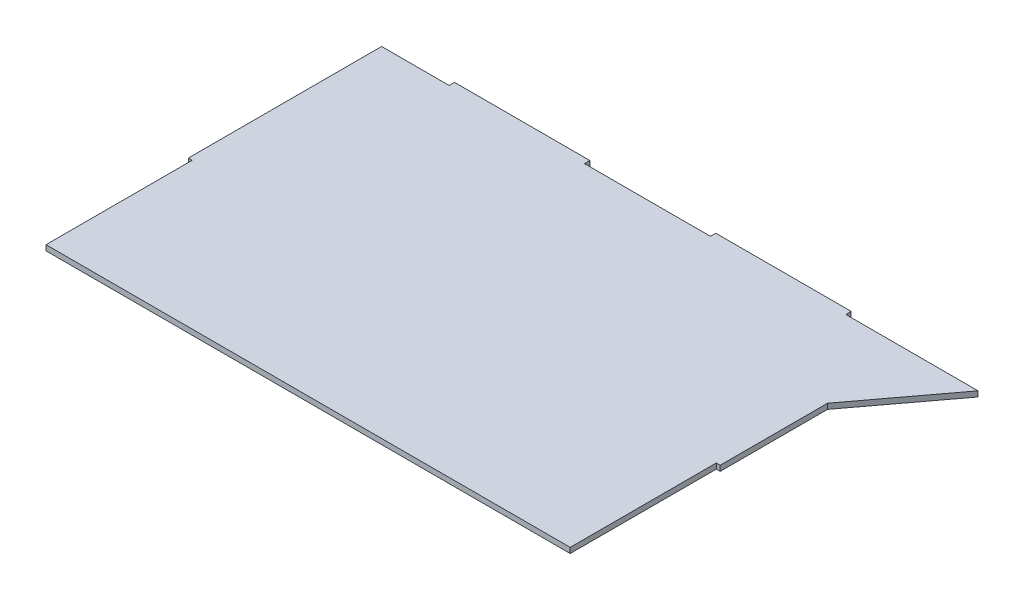
ISO-10303-21;
HEADER;
FILE_DESCRIPTION(('STEP AP214'),'2;1');
FILE_NAME('part.step','',(''),(''),'','','');
FILE_SCHEMA(('AUTOMOTIVE_DESIGN { 1 0 10303 214 1 1 1 1 }'));
ENDSEC;
DATA;
#1=APPLICATION_CONTEXT('core data for automotive mechanical design processes');
#2=APPLICATION_PROTOCOL_DEFINITION('international standard','automotive_design',2000,#1);
#3=PRODUCT_CONTEXT('',#1,'mechanical');
#4=PRODUCT('Part','Part','',(#3));
#5=PRODUCT_RELATED_PRODUCT_CATEGORY('part','',(#4));
#6=PRODUCT_DEFINITION_FORMATION('','',#4);
#7=PRODUCT_DEFINITION_CONTEXT('part definition',#1,'design');
#8=PRODUCT_DEFINITION('design','',#6,#7);
#9=PRODUCT_DEFINITION_SHAPE('','',#8);
#10=(LENGTH_UNIT() NAMED_UNIT(*) SI_UNIT(.MILLI.,.METRE.));
#11=(NAMED_UNIT(*) PLANE_ANGLE_UNIT() SI_UNIT($,.RADIAN.));
#12=(NAMED_UNIT(*) SI_UNIT($,.STERADIAN.) SOLID_ANGLE_UNIT());
#13=UNCERTAINTY_MEASURE_WITH_UNIT(LENGTH_MEASURE(1.E-05),#10,'distance_accuracy_value','');
#14=(GEOMETRIC_REPRESENTATION_CONTEXT(3) GLOBAL_UNCERTAINTY_ASSIGNED_CONTEXT((#13)) GLOBAL_UNIT_ASSIGNED_CONTEXT((#10,
#11,#12)) REPRESENTATION_CONTEXT('',''));
#15=CARTESIAN_POINT('',(0.,0.,0.));
#16=DIRECTION('',(0.,0.,1.));
#17=DIRECTION('',(1.,0.,0.));
#18=AXIS2_PLACEMENT_3D('',#15,#16,#17);
#19=CARTESIAN_POINT('',(157.16480632,-1.5875,200.60000012));
#20=DIRECTION('',(-1.,0.,0.));
#21=DIRECTION('',(0.,0.,1.));
#22=AXIS2_PLACEMENT_3D('',#19,#20,#21);
#23=PLANE('',#22);
#24=DIRECTION('',(0.,-1.,0.));
#25=VECTOR('',#24,1.);
#26=CARTESIAN_POINT('',(157.16480632,1.5875,50.8));
#27=LINE('',#26,#25);
#28=CARTESIAN_POINT('',(157.16480632,1.5875,50.8));
#29=VERTEX_POINT('',#28);
#30=CARTESIAN_POINT('',(157.16480632,-1.5875,50.8));
#31=VERTEX_POINT('',#30);
#32=EDGE_CURVE('E59',#29,#31,#27,.T.);
#33=ORIENTED_EDGE('',*,*,#32,.F.);
#34=DIRECTION('',(0.,0.,-1.));
#35=VECTOR('',#34,1.);
#36=CARTESIAN_POINT('',(157.16480632,1.5875,200.60000012));
#37=LINE('',#36,#35);
#38=CARTESIAN_POINT('',(157.16480632,1.5875,114.24000012));
#39=VERTEX_POINT('',#38);
#40=EDGE_CURVE('E185',#39,#29,#37,.T.);
#41=ORIENTED_EDGE('',*,*,#40,.F.);
#42=DIRECTION('',(0.,1.,0.));
#43=VECTOR('',#42,1.);
#44=CARTESIAN_POINT('',(157.16480632,-1.5875,114.24000012));
#45=LINE('',#44,#43);
#46=CARTESIAN_POINT('',(157.16480632,-1.5875,114.24000012));
#47=VERTEX_POINT('',#46);
#48=EDGE_CURVE('E11',#47,#39,#45,.T.);
#49=ORIENTED_EDGE('',*,*,#48,.F.);
#50=DIRECTION('',(0.,0.,-1.));
#51=VECTOR('',#50,1.);
#52=CARTESIAN_POINT('',(157.16480632,-1.5875,200.60000012));
#53=LINE('',#52,#51);
#54=EDGE_CURVE('E278',#47,#31,#53,.T.);
#55=ORIENTED_EDGE('',*,*,#54,.T.);
#56=EDGE_LOOP('',(#33,#41,#49,#55));
#57=FACE_BOUND('',#56,.T.);
#58=ADVANCED_FACE('F45',(#57),#23,.F.);
#59=CARTESIAN_POINT('',(0.,0.,0.));
#60=DIRECTION('',(0.,0.,-1.));
#61=DIRECTION('',(-1.,0.,0.));
#62=AXIS2_PLACEMENT_3D('',#59,#60,#61);
#63=PLANE('',#62);
#64=DIRECTION('',(-1.,0.,0.));
#65=VECTOR('',#64,1.);
#66=CARTESIAN_POINT('',(-157.16480632,1.5875,0.));
#67=LINE('',#66,#65);
#68=CARTESIAN_POINT('',(-117.26519368,1.5875,0.));
#69=VERTEX_POINT('',#68);
#70=CARTESIAN_POINT('',(-157.16480632,1.5875,0.));
#71=VERTEX_POINT('',#70);
#72=EDGE_CURVE('E67',#69,#71,#67,.T.);
#73=ORIENTED_EDGE('',*,*,#72,.F.);
#74=DIRECTION('',(0.,1.,0.));
#75=VECTOR('',#74,1.);
#76=CARTESIAN_POINT('',(-117.26519368,0.,0.));
#77=LINE('',#76,#75);
#78=CARTESIAN_POINT('',(-117.26519368,-1.5875,0.));
#79=VERTEX_POINT('',#78);
#80=EDGE_CURVE('E189',#79,#69,#77,.T.);
#81=ORIENTED_EDGE('',*,*,#80,.F.);
#82=DIRECTION('',(1.,0.,0.));
#83=VECTOR('',#82,1.);
#84=CARTESIAN_POINT('',(-157.16480632,-1.5875,0.));
#85=LINE('',#84,#83);
#86=CARTESIAN_POINT('',(-157.16480632,-1.5875,0.));
#87=VERTEX_POINT('',#86);
#88=EDGE_CURVE('E276',#87,#79,#85,.T.);
#89=ORIENTED_EDGE('',*,*,#88,.F.);
#90=DIRECTION('',(0.,-1.,0.));
#91=VECTOR('',#90,1.);
#92=CARTESIAN_POINT('',(-157.16480632,-1.5875,0.));
#93=LINE('',#92,#91);
#94=EDGE_CURVE('E173',#71,#87,#93,.T.);
#95=ORIENTED_EDGE('',*,*,#94,.F.);
#96=EDGE_LOOP('',(#73,#81,#89,#95));
#97=FACE_BOUND('',#96,.T.);
#98=ADVANCED_FACE('F348',(#97),#63,.T.);
#99=CARTESIAN_POINT('',(117.16480632,-1.5875,0.));
#100=VERTEX_POINT('',#99);
#101=CARTESIAN_POINT('',(195.26480632,-1.5875,0.));
#102=VERTEX_POINT('',#101);
#103=EDGE_CURVE('E282',#100,#102,#85,.T.);
#104=ORIENTED_EDGE('',*,*,#103,.F.);
#105=DIRECTION('',(0.,1.,0.));
#106=VECTOR('',#105,1.);
#107=CARTESIAN_POINT('',(117.16480632,0.,0.));
#108=LINE('',#107,#106);
#109=CARTESIAN_POINT('',(117.16480632,1.5875,0.));
#110=VERTEX_POINT('',#109);
#111=EDGE_CURVE('E169',#100,#110,#108,.T.);
#112=ORIENTED_EDGE('',*,*,#111,.T.);
#113=CARTESIAN_POINT('',(195.26480632,1.5875,0.));
#114=VERTEX_POINT('',#113);
#115=EDGE_CURVE('E163',#114,#110,#67,.T.);
#116=ORIENTED_EDGE('',*,*,#115,.F.);
#117=DIRECTION('',(0.,-1.,0.));
#118=VECTOR('',#117,1.);
#119=CARTESIAN_POINT('',(195.26480632,1.5875,0.));
#120=LINE('',#119,#118);
#121=EDGE_CURVE('E166',#114,#102,#120,.T.);
#122=ORIENTED_EDGE('',*,*,#121,.T.);
#123=EDGE_LOOP('',(#104,#112,#116,#122));
#124=FACE_BOUND('',#123,.T.);
#125=ADVANCED_FACE('F165',(#124),#63,.T.);
#126=CARTESIAN_POINT('',(-157.16480632,1.5875,200.60000012));
#127=DIRECTION('',(0.,-1.,0.));
#128=DIRECTION('',(0.,0.,-1.));
#129=AXIS2_PLACEMENT_3D('',#126,#127,#128);
#130=PLANE('',#129);
#131=DIRECTION('',(-1.,0.,0.));
#132=VECTOR('',#131,1.);
#133=CARTESIAN_POINT('',(-157.16480632,1.5875,114.24000012));
#134=LINE('',#133,#132);
#135=CARTESIAN_POINT('',(154.87880632,1.5875,114.24000012));
#136=VERTEX_POINT('',#135);
#137=EDGE_CURVE('E253',#39,#136,#134,.T.);
#138=ORIENTED_EDGE('',*,*,#137,.F.);
#139=ORIENTED_EDGE('',*,*,#40,.T.);
#140=DIRECTION('',(-0.6,0.,0.8));
#141=VECTOR('',#140,1.);
#142=CARTESIAN_POINT('',(195.26480632,1.5875,0.));
#143=LINE('',#142,#141);
#144=EDGE_CURVE('E179',#114,#29,#143,.T.);
#145=ORIENTED_EDGE('',*,*,#144,.F.);
#146=ORIENTED_EDGE('',*,*,#115,.T.);
#147=DIRECTION('',(0.,0.,1.));
#148=VECTOR('',#147,1.);
#149=CARTESIAN_POINT('',(117.16480632,1.5875,-3.175));
#150=LINE('',#149,#148);
#151=CARTESIAN_POINT('',(117.16480632,1.5875,-3.175));
#152=VERTEX_POINT('',#151);
#153=EDGE_CURVE('E235',#152,#110,#150,.T.);
#154=ORIENTED_EDGE('',*,*,#153,.F.);
#155=DIRECTION('',(-1.,0.,0.));
#156=VECTOR('',#155,1.);
#157=CARTESIAN_POINT('',(0.,1.5875,-3.175));
#158=LINE('',#157,#156);
#159=CARTESIAN_POINT('',(37.16480632,1.5875,-3.175));
#160=VERTEX_POINT('',#159);
#161=EDGE_CURVE('E223',#152,#160,#158,.T.);
#162=ORIENTED_EDGE('',*,*,#161,.T.);
#163=DIRECTION('',(0.,0.,1.));
#164=VECTOR('',#163,1.);
#165=CARTESIAN_POINT('',(37.16480632,1.5875,-3.175));
#166=LINE('',#165,#164);
#167=CARTESIAN_POINT('',(37.16480632,1.5875,0.));
#168=VERTEX_POINT('',#167);
#169=EDGE_CURVE('E237',#160,#168,#166,.T.);
#170=ORIENTED_EDGE('',*,*,#169,.T.);
#171=CARTESIAN_POINT('',(-37.2651936800001,1.5875,0.));
#172=VERTEX_POINT('',#171);
#173=EDGE_CURVE('E174',#168,#172,#67,.T.);
#174=ORIENTED_EDGE('',*,*,#173,.T.);
#175=DIRECTION('',(0.,0.,1.));
#176=VECTOR('',#175,1.);
#177=CARTESIAN_POINT('',(-37.2651936800001,1.5875,-3.175));
#178=LINE('',#177,#176);
#179=CARTESIAN_POINT('',(-37.2651936800001,1.5875,-3.175));
#180=VERTEX_POINT('',#179);
#181=EDGE_CURVE('E209',#180,#172,#178,.T.);
#182=ORIENTED_EDGE('',*,*,#181,.F.);
#183=DIRECTION('',(-1.,0.,0.));
#184=VECTOR('',#183,1.);
#185=CARTESIAN_POINT('',(-154.43,1.5875,-3.175));
#186=LINE('',#185,#184);
#187=CARTESIAN_POINT('',(-117.26519368,1.5875,-3.175));
#188=VERTEX_POINT('',#187);
#189=EDGE_CURVE('E197',#180,#188,#186,.T.);
#190=ORIENTED_EDGE('',*,*,#189,.T.);
#191=DIRECTION('',(0.,0.,1.));
#192=VECTOR('',#191,1.);
#193=CARTESIAN_POINT('',(-117.26519368,1.5875,-3.175));
#194=LINE('',#193,#192);
#195=EDGE_CURVE('E212',#188,#69,#194,.T.);
#196=ORIENTED_EDGE('',*,*,#195,.T.);
#197=ORIENTED_EDGE('',*,*,#72,.T.);
#198=DIRECTION('',(0.,0.,-1.));
#199=VECTOR('',#198,1.);
#200=CARTESIAN_POINT('',(-157.16480632,1.5875,200.60000012));
#201=LINE('',#200,#199);
#202=CARTESIAN_POINT('',(-157.16480632,1.5875,114.24000012));
#203=VERTEX_POINT('',#202);
#204=EDGE_CURVE('E289',#203,#71,#201,.T.);
#205=ORIENTED_EDGE('',*,*,#204,.F.);
#206=DIRECTION('',(1.,0.,0.));
#207=VECTOR('',#206,1.);
#208=CARTESIAN_POINT('',(-157.16480632,1.5875,114.24000012));
#209=LINE('',#208,#207);
#210=CARTESIAN_POINT('',(-154.87880632,1.5875,114.24000012));
#211=VERTEX_POINT('',#210);
#212=EDGE_CURVE('E270',#203,#211,#209,.T.);
#213=ORIENTED_EDGE('',*,*,#212,.T.);
#214=DIRECTION('',(0.,0.,-1.));
#215=VECTOR('',#214,1.);
#216=CARTESIAN_POINT('',(-154.87880632,1.5875,200.60000012));
#217=LINE('',#216,#215);
#218=CARTESIAN_POINT('',(-154.87880632,1.5875,200.60000012));
#219=VERTEX_POINT('',#218);
#220=EDGE_CURVE('E268',#219,#211,#217,.T.);
#221=ORIENTED_EDGE('',*,*,#220,.F.);
#222=DIRECTION('',(-1.,0.,0.));
#223=VECTOR('',#222,1.);
#224=CARTESIAN_POINT('',(-157.16480632,1.5875,200.60000012));
#225=LINE('',#224,#223);
#226=CARTESIAN_POINT('',(154.87880632,1.5875,200.60000012));
#227=VERTEX_POINT('',#226);
#228=EDGE_CURVE('E273',#227,#219,#225,.T.);
#229=ORIENTED_EDGE('',*,*,#228,.F.);
#230=DIRECTION('',(0.,0.,-1.));
#231=VECTOR('',#230,1.);
#232=CARTESIAN_POINT('',(154.87880632,1.5875,200.60000012));
#233=LINE('',#232,#231);
#234=EDGE_CURVE('E255',#227,#136,#233,.T.);
#235=ORIENTED_EDGE('',*,*,#234,.T.);
#236=EDGE_LOOP('',(#138,#139,#145,#146,#154,#162,#170,#174,#182,#190,#196,#197,#205,#213,#221,
#229,#235));
#237=FACE_BOUND('',#236,.T.);
#238=ADVANCED_FACE('F184',(#237),#130,.F.);
#239=CARTESIAN_POINT('',(-157.16480632,-1.5875,200.60000012));
#240=DIRECTION('',(0.,1.,0.));
#241=DIRECTION('',(0.,0.,1.));
#242=AXIS2_PLACEMENT_3D('',#239,#240,#241);
#243=PLANE('',#242);
#244=DIRECTION('',(-1.,0.,0.));
#245=VECTOR('',#244,1.);
#246=CARTESIAN_POINT('',(0.,-1.5875,114.24000012));
#247=LINE('',#246,#245);
#248=CARTESIAN_POINT('',(154.87880632,-1.5875,114.24000012));
#249=VERTEX_POINT('',#248);
#250=EDGE_CURVE('E243',#47,#249,#247,.T.);
#251=ORIENTED_EDGE('',*,*,#250,.T.);
#252=DIRECTION('',(0.,0.,-1.));
#253=VECTOR('',#252,1.);
#254=CARTESIAN_POINT('',(154.87880632,-1.5875,0.));
#255=LINE('',#254,#253);
#256=CARTESIAN_POINT('',(154.87880632,-1.5875,200.60000012));
#257=VERTEX_POINT('',#256);
#258=EDGE_CURVE('E246',#257,#249,#255,.T.);
#259=ORIENTED_EDGE('',*,*,#258,.F.);
#260=DIRECTION('',(1.,0.,0.));
#261=VECTOR('',#260,1.);
#262=CARTESIAN_POINT('',(-157.16480632,-1.5875,200.60000012));
#263=LINE('',#262,#261);
#264=CARTESIAN_POINT('',(-154.87880632,-1.5875,200.60000012));
#265=VERTEX_POINT('',#264);
#266=EDGE_CURVE('E275',#265,#257,#263,.T.);
#267=ORIENTED_EDGE('',*,*,#266,.F.);
#268=DIRECTION('',(0.,0.,-1.));
#269=VECTOR('',#268,1.);
#270=CARTESIAN_POINT('',(-154.87880632,-1.5875,0.));
#271=LINE('',#270,#269);
#272=CARTESIAN_POINT('',(-154.87880632,-1.5875,114.24000012));
#273=VERTEX_POINT('',#272);
#274=EDGE_CURVE('E258',#265,#273,#271,.T.);
#275=ORIENTED_EDGE('',*,*,#274,.T.);
#276=DIRECTION('',(1.,0.,0.));
#277=VECTOR('',#276,1.);
#278=CARTESIAN_POINT('',(0.,-1.5875,114.24000012));
#279=LINE('',#278,#277);
#280=CARTESIAN_POINT('',(-157.16480632,-1.5875,114.24000012));
#281=VERTEX_POINT('',#280);
#282=EDGE_CURVE('E261',#281,#273,#279,.T.);
#283=ORIENTED_EDGE('',*,*,#282,.F.);
#284=DIRECTION('',(0.,0.,-1.));
#285=VECTOR('',#284,1.);
#286=CARTESIAN_POINT('',(-157.16480632,-1.5875,200.60000012));
#287=LINE('',#286,#285);
#288=EDGE_CURVE('E287',#281,#87,#287,.T.);
#289=ORIENTED_EDGE('',*,*,#288,.T.);
#290=ORIENTED_EDGE('',*,*,#88,.T.);
#291=DIRECTION('',(0.,0.,1.));
#292=VECTOR('',#291,1.);
#293=CARTESIAN_POINT('',(-117.26519368,-1.5875,-3.175));
#294=LINE('',#293,#292);
#295=CARTESIAN_POINT('',(-117.26519368,-1.5875,-3.175));
#296=VERTEX_POINT('',#295);
#297=EDGE_CURVE('E214',#296,#79,#294,.T.);
#298=ORIENTED_EDGE('',*,*,#297,.F.);
#299=DIRECTION('',(-1.,0.,0.));
#300=VECTOR('',#299,1.);
#301=CARTESIAN_POINT('',(-154.43,-1.5875,-3.175));
#302=LINE('',#301,#300);
#303=CARTESIAN_POINT('',(-37.2651936800001,-1.5875,-3.175));
#304=VERTEX_POINT('',#303);
#305=EDGE_CURVE('E191',#304,#296,#302,.T.);
#306=ORIENTED_EDGE('',*,*,#305,.F.);
#307=DIRECTION('',(0.,0.,1.));
#308=VECTOR('',#307,1.);
#309=CARTESIAN_POINT('',(-37.2651936800001,-1.5875,-3.175));
#310=LINE('',#309,#308);
#311=CARTESIAN_POINT('',(-37.2651936800001,-1.5875,0.));
#312=VERTEX_POINT('',#311);
#313=EDGE_CURVE('E203',#304,#312,#310,.T.);
#314=ORIENTED_EDGE('',*,*,#313,.T.);
#315=CARTESIAN_POINT('',(37.1648063199999,-1.5875,0.));
#316=VERTEX_POINT('',#315);
#317=EDGE_CURVE('E285',#312,#316,#85,.T.);
#318=ORIENTED_EDGE('',*,*,#317,.T.);
#319=DIRECTION('',(0.,0.,1.));
#320=VECTOR('',#319,1.);
#321=CARTESIAN_POINT('',(37.16480632,-1.5875,-3.175));
#322=LINE('',#321,#320);
#323=CARTESIAN_POINT('',(37.16480632,-1.5875,-3.175));
#324=VERTEX_POINT('',#323);
#325=EDGE_CURVE('E240',#324,#316,#322,.T.);
#326=ORIENTED_EDGE('',*,*,#325,.F.);
#327=DIRECTION('',(-1.,0.,0.));
#328=VECTOR('',#327,1.);
#329=CARTESIAN_POINT('',(0.,-1.5875,-3.175));
#330=LINE('',#329,#328);
#331=CARTESIAN_POINT('',(117.16480632,-1.5875,-3.175));
#332=VERTEX_POINT('',#331);
#333=EDGE_CURVE('E218',#332,#324,#330,.T.);
#334=ORIENTED_EDGE('',*,*,#333,.F.);
#335=DIRECTION('',(0.,0.,1.));
#336=VECTOR('',#335,1.);
#337=CARTESIAN_POINT('',(117.16480632,-1.5875,-3.175));
#338=LINE('',#337,#336);
#339=EDGE_CURVE('E229',#332,#100,#338,.T.);
#340=ORIENTED_EDGE('',*,*,#339,.T.);
#341=ORIENTED_EDGE('',*,*,#103,.T.);
#342=DIRECTION('',(-0.6,0.,0.8));
#343=VECTOR('',#342,1.);
#344=CARTESIAN_POINT('',(195.26480632,-1.5875,0.));
#345=LINE('',#344,#343);
#346=EDGE_CURVE('E181',#102,#31,#345,.T.);
#347=ORIENTED_EDGE('',*,*,#346,.T.);
#348=ORIENTED_EDGE('',*,*,#54,.F.);
#349=EDGE_LOOP('',(#251,#259,#267,#275,#283,#289,#290,#298,#306,#314,#318,#326,#334,#340,#341,
#347,#348));
#350=FACE_BOUND('',#349,.T.);
#351=ADVANCED_FACE('F311',(#350),#243,.F.);
#352=CARTESIAN_POINT('',(0.,0.,200.60000012));
#353=DIRECTION('',(0.,0.,-1.));
#354=DIRECTION('',(-1.,0.,0.));
#355=AXIS2_PLACEMENT_3D('',#352,#353,#354);
#356=PLANE('',#355);
#357=ORIENTED_EDGE('',*,*,#266,.T.);
#358=DIRECTION('',(0.,-1.,0.));
#359=VECTOR('',#358,1.);
#360=CARTESIAN_POINT('',(154.87880632,1.587512,200.60000012));
#361=LINE('',#360,#359);
#362=EDGE_CURVE('E249',#227,#257,#361,.T.);
#363=ORIENTED_EDGE('',*,*,#362,.F.);
#364=ORIENTED_EDGE('',*,*,#228,.T.);
#365=DIRECTION('',(0.,1.,0.));
#366=VECTOR('',#365,1.);
#367=CARTESIAN_POINT('',(-154.87880632,0.,200.60000012));
#368=LINE('',#367,#366);
#369=EDGE_CURVE('E52',#265,#219,#368,.T.);
#370=ORIENTED_EDGE('',*,*,#369,.F.);
#371=EDGE_LOOP('',(#357,#363,#364,#370));
#372=FACE_BOUND('',#371,.T.);
#373=ADVANCED_FACE('F315',(#372),#356,.F.);
#374=CARTESIAN_POINT('',(-157.16480632,-1.5875,200.60000012));
#375=DIRECTION('',(1.,0.,0.));
#376=DIRECTION('',(0.,0.,-1.));
#377=AXIS2_PLACEMENT_3D('',#374,#375,#376);
#378=PLANE('',#377);
#379=ORIENTED_EDGE('',*,*,#288,.F.);
#380=DIRECTION('',(0.,-1.,0.));
#381=VECTOR('',#380,1.);
#382=CARTESIAN_POINT('',(-157.16480632,1.587512,114.24000012));
#383=LINE('',#382,#381);
#384=EDGE_CURVE('E264',#203,#281,#383,.T.);
#385=ORIENTED_EDGE('',*,*,#384,.F.);
#386=ORIENTED_EDGE('',*,*,#204,.T.);
#387=ORIENTED_EDGE('',*,*,#94,.T.);
#388=EDGE_LOOP('',(#379,#385,#386,#387));
#389=FACE_BOUND('',#388,.T.);
#390=ADVANCED_FACE('F308',(#389),#378,.F.);
#391=DIRECTION('',(0.,1.,0.));
#392=VECTOR('',#391,1.);
#393=CARTESIAN_POINT('',(-37.2651936800001,0.,0.));
#394=LINE('',#393,#392);
#395=EDGE_CURVE('E195',#312,#172,#394,.T.);
#396=ORIENTED_EDGE('',*,*,#395,.T.);
#397=ORIENTED_EDGE('',*,*,#173,.F.);
#398=DIRECTION('',(0.,1.,0.));
#399=VECTOR('',#398,1.);
#400=CARTESIAN_POINT('',(37.16480632,0.,0.));
#401=LINE('',#400,#399);
#402=EDGE_CURVE('E217',#316,#168,#401,.T.);
#403=ORIENTED_EDGE('',*,*,#402,.F.);
#404=ORIENTED_EDGE('',*,*,#317,.F.);
#405=EDGE_LOOP('',(#396,#397,#403,#404));
#406=FACE_BOUND('',#405,.T.);
#407=ADVANCED_FACE('F328',(#406),#63,.T.);
#408=CARTESIAN_POINT('',(0.,1.587512,114.24000012));
#409=DIRECTION('',(0.,0.,-1.));
#410=DIRECTION('',(-1.,0.,0.));
#411=AXIS2_PLACEMENT_3D('',#408,#409,#410);
#412=PLANE('',#411);
#413=ORIENTED_EDGE('',*,*,#384,.T.);
#414=ORIENTED_EDGE('',*,*,#282,.T.);
#415=DIRECTION('',(0.,-1.,0.));
#416=VECTOR('',#415,1.);
#417=CARTESIAN_POINT('',(-154.87880632,1.587512,114.24000012));
#418=LINE('',#417,#416);
#419=EDGE_CURVE('E266',#211,#273,#418,.T.);
#420=ORIENTED_EDGE('',*,*,#419,.F.);
#421=ORIENTED_EDGE('',*,*,#212,.F.);
#422=EDGE_LOOP('',(#413,#414,#420,#421));
#423=FACE_BOUND('',#422,.T.);
#424=ADVANCED_FACE('F304',(#423),#412,.F.);
#425=CARTESIAN_POINT('',(-154.87880632,1.587512,0.));
#426=DIRECTION('',(-1.,0.,0.));
#427=DIRECTION('',(0.,0.,1.));
#428=AXIS2_PLACEMENT_3D('',#425,#426,#427);
#429=PLANE('',#428);
#430=ORIENTED_EDGE('',*,*,#220,.T.);
#431=ORIENTED_EDGE('',*,*,#419,.T.);
#432=ORIENTED_EDGE('',*,*,#274,.F.);
#433=ORIENTED_EDGE('',*,*,#369,.T.);
#434=EDGE_LOOP('',(#430,#431,#432,#433));
#435=FACE_BOUND('',#434,.T.);
#436=ADVANCED_FACE('F296',(#435),#429,.T.);
#437=CARTESIAN_POINT('',(154.87880632,1.587512,0.));
#438=DIRECTION('',(-1.,0.,0.));
#439=DIRECTION('',(0.,0.,1.));
#440=AXIS2_PLACEMENT_3D('',#437,#438,#439);
#441=PLANE('',#440);
#442=ORIENTED_EDGE('',*,*,#362,.T.);
#443=ORIENTED_EDGE('',*,*,#258,.T.);
#444=DIRECTION('',(0.,-1.,0.));
#445=VECTOR('',#444,1.);
#446=CARTESIAN_POINT('',(154.87880632,1.587512,114.24000012));
#447=LINE('',#446,#445);
#448=EDGE_CURVE('E251',#136,#249,#447,.T.);
#449=ORIENTED_EDGE('',*,*,#448,.F.);
#450=ORIENTED_EDGE('',*,*,#234,.F.);
#451=EDGE_LOOP('',(#442,#443,#449,#450));
#452=FACE_BOUND('',#451,.T.);
#453=ADVANCED_FACE('F317',(#452),#441,.F.);
#454=CARTESIAN_POINT('',(0.,1.587512,114.24000012));
#455=DIRECTION('',(0.,0.,1.));
#456=DIRECTION('',(1.,0.,0.));
#457=AXIS2_PLACEMENT_3D('',#454,#455,#456);
#458=PLANE('',#457);
#459=ORIENTED_EDGE('',*,*,#137,.T.);
#460=ORIENTED_EDGE('',*,*,#448,.T.);
#461=ORIENTED_EDGE('',*,*,#250,.F.);
#462=ORIENTED_EDGE('',*,*,#48,.T.);
#463=EDGE_LOOP('',(#459,#460,#461,#462));
#464=FACE_BOUND('',#463,.T.);
#465=ADVANCED_FACE('F439',(#464),#458,.T.);
#466=CARTESIAN_POINT('',(37.16480632,0.,-3.175));
#467=DIRECTION('',(1.,0.,0.));
#468=DIRECTION('',(0.,0.,-1.));
#469=AXIS2_PLACEMENT_3D('',#466,#467,#468);
#470=PLANE('',#469);
#471=ORIENTED_EDGE('',*,*,#402,.T.);
#472=ORIENTED_EDGE('',*,*,#169,.F.);
#473=DIRECTION('',(0.,1.,0.));
#474=VECTOR('',#473,1.);
#475=CARTESIAN_POINT('',(37.16480632,0.,-3.175));
#476=LINE('',#475,#474);
#477=EDGE_CURVE('E221',#324,#160,#476,.T.);
#478=ORIENTED_EDGE('',*,*,#477,.F.);
#479=ORIENTED_EDGE('',*,*,#325,.T.);
#480=EDGE_LOOP('',(#471,#472,#478,#479));
#481=FACE_BOUND('',#480,.T.);
#482=ADVANCED_FACE('F332',(#481),#470,.F.);
#483=CARTESIAN_POINT('',(117.16480632,0.,-3.175));
#484=DIRECTION('',(1.,0.,0.));
#485=DIRECTION('',(0.,0.,-1.));
#486=AXIS2_PLACEMENT_3D('',#483,#484,#485);
#487=PLANE('',#486);
#488=ORIENTED_EDGE('',*,*,#111,.F.);
#489=ORIENTED_EDGE('',*,*,#339,.F.);
#490=DIRECTION('',(0.,1.,0.));
#491=VECTOR('',#490,1.);
#492=CARTESIAN_POINT('',(117.16480632,0.,-3.175));
#493=LINE('',#492,#491);
#494=EDGE_CURVE('E226',#332,#152,#493,.T.);
#495=ORIENTED_EDGE('',*,*,#494,.T.);
#496=ORIENTED_EDGE('',*,*,#153,.T.);
#497=EDGE_LOOP('',(#488,#489,#495,#496));
#498=FACE_BOUND('',#497,.T.);
#499=ADVANCED_FACE('F338',(#498),#487,.T.);
#500=CARTESIAN_POINT('',(0.,0.,-3.175));
#501=DIRECTION('',(0.,0.,-1.));
#502=DIRECTION('',(-1.,0.,0.));
#503=AXIS2_PLACEMENT_3D('',#500,#501,#502);
#504=PLANE('',#503);
#505=ORIENTED_EDGE('',*,*,#333,.T.);
#506=ORIENTED_EDGE('',*,*,#477,.T.);
#507=ORIENTED_EDGE('',*,*,#161,.F.);
#508=ORIENTED_EDGE('',*,*,#494,.F.);
#509=EDGE_LOOP('',(#505,#506,#507,#508));
#510=FACE_BOUND('',#509,.T.);
#511=ADVANCED_FACE('F336',(#510),#504,.T.);
#512=CARTESIAN_POINT('',(-117.26519368,0.,-3.175));
#513=DIRECTION('',(1.,0.,0.));
#514=DIRECTION('',(0.,0.,-1.));
#515=AXIS2_PLACEMENT_3D('',#512,#513,#514);
#516=PLANE('',#515);
#517=ORIENTED_EDGE('',*,*,#80,.T.);
#518=ORIENTED_EDGE('',*,*,#195,.F.);
#519=DIRECTION('',(0.,1.,0.));
#520=VECTOR('',#519,1.);
#521=CARTESIAN_POINT('',(-117.26519368,0.,-3.175));
#522=LINE('',#521,#520);
#523=EDGE_CURVE('E194',#296,#188,#522,.T.);
#524=ORIENTED_EDGE('',*,*,#523,.F.);
#525=ORIENTED_EDGE('',*,*,#297,.T.);
#526=EDGE_LOOP('',(#517,#518,#524,#525));
#527=FACE_BOUND('',#526,.T.);
#528=ADVANCED_FACE('F347',(#527),#516,.F.);
#529=CARTESIAN_POINT('',(-37.2651936800001,0.,-3.175));
#530=DIRECTION('',(1.,0.,0.));
#531=DIRECTION('',(0.,0.,-1.));
#532=AXIS2_PLACEMENT_3D('',#529,#530,#531);
#533=PLANE('',#532);
#534=ORIENTED_EDGE('',*,*,#395,.F.);
#535=ORIENTED_EDGE('',*,*,#313,.F.);
#536=DIRECTION('',(0.,1.,0.));
#537=VECTOR('',#536,1.);
#538=CARTESIAN_POINT('',(-37.2651936800001,0.,-3.175));
#539=LINE('',#538,#537);
#540=EDGE_CURVE('E200',#304,#180,#539,.T.);
#541=ORIENTED_EDGE('',*,*,#540,.T.);
#542=ORIENTED_EDGE('',*,*,#181,.T.);
#543=EDGE_LOOP('',(#534,#535,#541,#542));
#544=FACE_BOUND('',#543,.T.);
#545=ADVANCED_FACE('F341',(#544),#533,.T.);
#546=CARTESIAN_POINT('',(-154.43,0.,-3.175));
#547=DIRECTION('',(0.,0.,-1.));
#548=DIRECTION('',(-1.,0.,0.));
#549=AXIS2_PLACEMENT_3D('',#546,#547,#548);
#550=PLANE('',#549);
#551=ORIENTED_EDGE('',*,*,#305,.T.);
#552=ORIENTED_EDGE('',*,*,#523,.T.);
#553=ORIENTED_EDGE('',*,*,#189,.F.);
#554=ORIENTED_EDGE('',*,*,#540,.F.);
#555=EDGE_LOOP('',(#551,#552,#553,#554));
#556=FACE_BOUND('',#555,.T.);
#557=ADVANCED_FACE('F344',(#556),#550,.T.);
#558=CARTESIAN_POINT('',(195.26480632,1.5875,0.));
#559=DIRECTION('',(0.8,0.,0.6));
#560=DIRECTION('',(0.6,0.,-0.8));
#561=AXIS2_PLACEMENT_3D('',#558,#559,#560);
#562=PLANE('',#561);
#563=ORIENTED_EDGE('',*,*,#346,.F.);
#564=ORIENTED_EDGE('',*,*,#121,.F.);
#565=ORIENTED_EDGE('',*,*,#144,.T.);
#566=ORIENTED_EDGE('',*,*,#32,.T.);
#567=EDGE_LOOP('',(#563,#564,#565,#566));
#568=FACE_BOUND('',#567,.T.);
#569=ADVANCED_FACE('F178',(#568),#562,.T.);
#570=CLOSED_SHELL('',(#58,#98,#125,#238,#351,#373,#390,#407,#424,#436,#453,#465,#482,#499,#511,
#528,#545,#557,#569));
#571=MANIFOLD_SOLID_BREP('B2',#570);
#572=ADVANCED_BREP_SHAPE_REPRESENTATION('',(#18,#571),#14);
#573=SHAPE_DEFINITION_REPRESENTATION(#9,#572);
ENDSEC;
END-ISO-10303-21;
